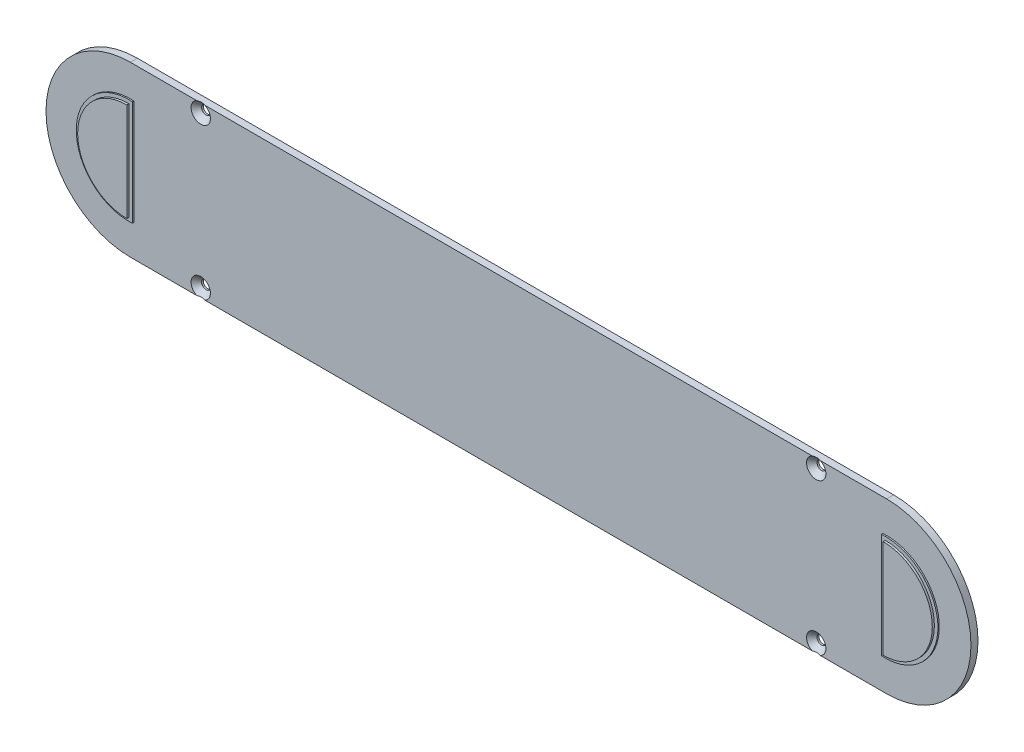
ISO-10303-21;
HEADER;
FILE_DESCRIPTION(('STEP AP214'),'2;1');
FILE_NAME('part.step','',(''),(''),'','','');
FILE_SCHEMA(('AUTOMOTIVE_DESIGN { 1 0 10303 214 1 1 1 1 }'));
ENDSEC;
DATA;
#1=APPLICATION_CONTEXT('core data for automotive mechanical design processes');
#2=APPLICATION_PROTOCOL_DEFINITION('international standard','automotive_design',2000,#1);
#3=PRODUCT_CONTEXT('',#1,'mechanical');
#4=PRODUCT('Part','Part','',(#3));
#5=PRODUCT_RELATED_PRODUCT_CATEGORY('part','',(#4));
#6=PRODUCT_DEFINITION_FORMATION('','',#4);
#7=PRODUCT_DEFINITION_CONTEXT('part definition',#1,'design');
#8=PRODUCT_DEFINITION('design','',#6,#7);
#9=PRODUCT_DEFINITION_SHAPE('','',#8);
#10=(LENGTH_UNIT() NAMED_UNIT(*) SI_UNIT(.MILLI.,.METRE.));
#11=(NAMED_UNIT(*) PLANE_ANGLE_UNIT() SI_UNIT($,.RADIAN.));
#12=(NAMED_UNIT(*) SI_UNIT($,.STERADIAN.) SOLID_ANGLE_UNIT());
#13=UNCERTAINTY_MEASURE_WITH_UNIT(LENGTH_MEASURE(1.E-05),#10,'distance_accuracy_value','');
#14=(GEOMETRIC_REPRESENTATION_CONTEXT(3) GLOBAL_UNCERTAINTY_ASSIGNED_CONTEXT((#13)) GLOBAL_UNIT_ASSIGNED_CONTEXT((#10,
#11,#12)) REPRESENTATION_CONTEXT('',''));
#15=CARTESIAN_POINT('',(0.,0.,0.));
#16=DIRECTION('',(0.,0.,1.));
#17=DIRECTION('',(1.,0.,0.));
#18=AXIS2_PLACEMENT_3D('',#15,#16,#17);
#19=CARTESIAN_POINT('',(-107.5,0.,2.));
#20=DIRECTION('',(0.,0.,1.));
#21=DIRECTION('',(1.,0.,0.));
#22=AXIS2_PLACEMENT_3D('',#19,#20,#21);
#23=PLANE('',#22);
#24=DIRECTION('',(0.,1.,0.));
#25=VECTOR('',#24,1.);
#26=CARTESIAN_POINT('',(-106.5,-14.9666295470958,2.));
#27=LINE('',#26,#25);
#28=CARTESIAN_POINT('',(-106.5,-14.9666295470958,2.));
#29=VERTEX_POINT('',#28);
#30=CARTESIAN_POINT('',(-106.5,14.9666295470958,2.));
#31=VERTEX_POINT('',#30);
#32=EDGE_CURVE('E177',#29,#31,#27,.T.);
#33=ORIENTED_EDGE('',*,*,#32,.F.);
#34=CARTESIAN_POINT('',(-107.5,0.,2.));
#35=DIRECTION('',(0.,0.,1.));
#36=DIRECTION('',(1.,0.,0.));
#37=AXIS2_PLACEMENT_3D('',#34,#35,#36);
#38=CIRCLE('',#37,15.);
#39=EDGE_CURVE('E172',#31,#29,#38,.T.);
#40=ORIENTED_EDGE('',*,*,#39,.F.);
#41=EDGE_LOOP('',(#33,#40));
#42=FACE_BOUND('',#41,.T.);
#43=DIRECTION('',(-1.,0.,0.));
#44=VECTOR('',#43,1.);
#45=CARTESIAN_POINT('',(107.5,24.,2.));
#46=LINE('',#45,#44);
#47=CARTESIAN_POINT('',(107.5,24.,2.));
#48=VERTEX_POINT('',#47);
#49=CARTESIAN_POINT('',(88.6456439237392,24.,2.));
#50=VERTEX_POINT('',#49);
#51=EDGE_CURVE('E226',#48,#50,#46,.T.);
#52=ORIENTED_EDGE('',*,*,#51,.T.);
#53=CARTESIAN_POINT('',(87.5,21.5,2.));
#54=DIRECTION('',(0.,0.,1.));
#55=DIRECTION('',(1.,0.,0.));
#56=AXIS2_PLACEMENT_3D('',#53,#54,#55);
#57=CIRCLE('',#56,2.75000000000006);
#58=CARTESIAN_POINT('',(86.3543560762609,24.,2.));
#59=VERTEX_POINT('',#58);
#60=EDGE_CURVE('E271',#50,#59,#57,.F.);
#61=ORIENTED_EDGE('',*,*,#60,.T.);
#62=CARTESIAN_POINT('',(-86.3543560762609,24.,2.));
#63=VERTEX_POINT('',#62);
#64=EDGE_CURVE('E249',#59,#63,#46,.T.);
#65=ORIENTED_EDGE('',*,*,#64,.T.);
#66=CARTESIAN_POINT('',(-87.5,21.5,2.));
#67=DIRECTION('',(0.,0.,1.));
#68=DIRECTION('',(1.,0.,0.));
#69=AXIS2_PLACEMENT_3D('',#66,#67,#68);
#70=CIRCLE('',#69,2.75000000000006);
#71=CARTESIAN_POINT('',(-88.645643923739,24.,2.));
#72=VERTEX_POINT('',#71);
#73=EDGE_CURVE('E262',#63,#72,#70,.F.);
#74=ORIENTED_EDGE('',*,*,#73,.T.);
#75=CARTESIAN_POINT('',(-107.5,24.,2.));
#76=VERTEX_POINT('',#75);
#77=EDGE_CURVE('E246',#72,#76,#46,.T.);
#78=ORIENTED_EDGE('',*,*,#77,.T.);
#79=CARTESIAN_POINT('',(-107.5,0.,2.));
#80=DIRECTION('',(0.,0.,1.));
#81=DIRECTION('',(1.,0.,0.));
#82=AXIS2_PLACEMENT_3D('',#79,#80,#81);
#83=CIRCLE('',#82,24.);
#84=CARTESIAN_POINT('',(-107.5,-24.,2.));
#85=VERTEX_POINT('',#84);
#86=EDGE_CURVE('E221',#76,#85,#83,.T.);
#87=ORIENTED_EDGE('',*,*,#86,.T.);
#88=DIRECTION('',(1.,0.,0.));
#89=VECTOR('',#88,1.);
#90=CARTESIAN_POINT('',(-107.5,-24.,2.));
#91=LINE('',#90,#89);
#92=CARTESIAN_POINT('',(-88.6456439237392,-24.,2.));
#93=VERTEX_POINT('',#92);
#94=EDGE_CURVE('E239',#85,#93,#91,.T.);
#95=ORIENTED_EDGE('',*,*,#94,.T.);
#96=CARTESIAN_POINT('',(-87.5,-21.5,2.));
#97=DIRECTION('',(0.,0.,1.));
#98=DIRECTION('',(1.,0.,0.));
#99=AXIS2_PLACEMENT_3D('',#96,#97,#98);
#100=CIRCLE('',#99,2.75000000000009);
#101=CARTESIAN_POINT('',(-86.3543560762608,-24.,2.));
#102=VERTEX_POINT('',#101);
#103=EDGE_CURVE('E265',#93,#102,#100,.F.);
#104=ORIENTED_EDGE('',*,*,#103,.T.);
#105=CARTESIAN_POINT('',(86.3543560762609,-24.,2.));
#106=VERTEX_POINT('',#105);
#107=EDGE_CURVE('E243',#102,#106,#91,.T.);
#108=ORIENTED_EDGE('',*,*,#107,.T.);
#109=CARTESIAN_POINT('',(87.5,-21.5,2.));
#110=DIRECTION('',(0.,0.,1.));
#111=DIRECTION('',(1.,0.,0.));
#112=AXIS2_PLACEMENT_3D('',#109,#110,#111);
#113=CIRCLE('',#112,2.75000000000006);
#114=CARTESIAN_POINT('',(88.6456439237391,-24.,2.));
#115=VERTEX_POINT('',#114);
#116=EDGE_CURVE('E268',#106,#115,#113,.F.);
#117=ORIENTED_EDGE('',*,*,#116,.T.);
#118=CARTESIAN_POINT('',(107.5,-24.,2.));
#119=VERTEX_POINT('',#118);
#120=EDGE_CURVE('E238',#115,#119,#91,.T.);
#121=ORIENTED_EDGE('',*,*,#120,.T.);
#122=CARTESIAN_POINT('',(107.5,0.,2.));
#123=DIRECTION('',(0.,0.,1.));
#124=DIRECTION('',(1.,0.,0.));
#125=AXIS2_PLACEMENT_3D('',#122,#123,#124);
#126=CIRCLE('',#125,24.);
#127=EDGE_CURVE('E242',#119,#48,#126,.T.);
#128=ORIENTED_EDGE('',*,*,#127,.T.);
#129=EDGE_LOOP('',(#52,#61,#65,#74,#78,#87,#95,#104,#108,#117,#121,#128));
#130=FACE_BOUND('',#129,.T.);
#131=DIRECTION('',(0.,-1.,0.));
#132=VECTOR('',#131,1.);
#133=CARTESIAN_POINT('',(106.5,14.9666295470958,2.));
#134=LINE('',#133,#132);
#135=CARTESIAN_POINT('',(106.5,14.9666295470958,2.));
#136=VERTEX_POINT('',#135);
#137=CARTESIAN_POINT('',(106.5,-14.9666295470958,2.));
#138=VERTEX_POINT('',#137);
#139=EDGE_CURVE('E159',#136,#138,#134,.T.);
#140=ORIENTED_EDGE('',*,*,#139,.F.);
#141=CARTESIAN_POINT('',(107.5,0.,2.));
#142=DIRECTION('',(0.,0.,1.));
#143=DIRECTION('',(1.,0.,0.));
#144=AXIS2_PLACEMENT_3D('',#141,#142,#143);
#145=CIRCLE('',#144,15.);
#146=EDGE_CURVE('E49',#138,#136,#145,.T.);
#147=ORIENTED_EDGE('',*,*,#146,.F.);
#148=EDGE_LOOP('',(#140,#147));
#149=FACE_BOUND('',#148,.T.);
#150=ADVANCED_FACE('F33',(#42,#130,#149),#23,.T.);
#151=CARTESIAN_POINT('',(-107.5,0.,0.));
#152=DIRECTION('',(0.,0.,1.));
#153=DIRECTION('',(1.,0.,0.));
#154=AXIS2_PLACEMENT_3D('',#151,#152,#153);
#155=CYLINDRICAL_SURFACE('',#154,24.);
#156=ORIENTED_EDGE('',*,*,#86,.F.);
#157=DIRECTION('',(0.,0.,1.));
#158=VECTOR('',#157,1.);
#159=CARTESIAN_POINT('',(-107.5,24.,0.));
#160=LINE('',#159,#158);
#161=CARTESIAN_POINT('',(-107.5,24.,0.));
#162=VERTEX_POINT('',#161);
#163=EDGE_CURVE('E250',#162,#76,#160,.T.);
#164=ORIENTED_EDGE('',*,*,#163,.F.);
#165=CARTESIAN_POINT('',(-107.5,0.,0.));
#166=DIRECTION('',(0.,0.,1.));
#167=DIRECTION('',(1.,0.,0.));
#168=AXIS2_PLACEMENT_3D('',#165,#166,#167);
#169=CIRCLE('',#168,24.);
#170=CARTESIAN_POINT('',(-107.5,-24.,0.));
#171=VERTEX_POINT('',#170);
#172=EDGE_CURVE('E222',#162,#171,#169,.T.);
#173=ORIENTED_EDGE('',*,*,#172,.T.);
#174=DIRECTION('',(0.,0.,1.));
#175=VECTOR('',#174,1.);
#176=CARTESIAN_POINT('',(-107.5,-24.,0.));
#177=LINE('',#176,#175);
#178=EDGE_CURVE('E235',#171,#85,#177,.T.);
#179=ORIENTED_EDGE('',*,*,#178,.T.);
#180=EDGE_LOOP('',(#156,#164,#173,#179));
#181=FACE_BOUND('',#180,.T.);
#182=ADVANCED_FACE('F292',(#181),#155,.T.);
#183=CARTESIAN_POINT('',(107.5,24.,0.));
#184=DIRECTION('',(0.,1.,0.));
#185=DIRECTION('',(-1.,0.,0.));
#186=AXIS2_PLACEMENT_3D('',#183,#184,#185);
#187=PLANE('',#186);
#188=ORIENTED_EDGE('',*,*,#64,.F.);
#189=CARTESIAN_POINT('',(86.3543560762609,24.,2.));
#190=CARTESIAN_POINT('',(86.4387621160316,24.,1.96483137179476));
#191=CARTESIAN_POINT('',(86.5244094806144,24.,1.93236499251594));
#192=CARTESIAN_POINT('',(86.6982325447831,24.,1.874140577509));
#193=CARTESIAN_POINT('',(86.7864152410339,24.,1.84840358705028));
#194=CARTESIAN_POINT('',(86.9639497535042,24.,1.80538984076342));
#195=CARTESIAN_POINT('',(87.053281443329,24.,1.78803209866768));
#196=CARTESIAN_POINT('',(87.2331686113206,24.,1.76262661852657));
#197=CARTESIAN_POINT('',(87.3237223485654,24.,1.75456681300498));
#198=CARTESIAN_POINT('',(87.5005204880953,24.,1.74851915694905));
#199=CARTESIAN_POINT('',(87.5867478937963,24.,1.75003627910019));
#200=CARTESIAN_POINT('',(87.7586271303844,24.,1.76187791632524));
#201=CARTESIAN_POINT('',(87.844278657842,24.,1.77220675592079));
#202=CARTESIAN_POINT('',(88.014124519429,24.,1.80094374692522));
#203=CARTESIAN_POINT('',(88.0983198273198,24.,1.81934626380263));
#204=CARTESIAN_POINT('',(88.2648670163354,24.,1.8631510460709));
#205=CARTESIAN_POINT('',(88.347218478945,24.,1.88855488354805));
#206=CARTESIAN_POINT('',(88.4651758301111,24.,1.92962366336638));
#207=CARTESIAN_POINT('',(88.5016106615225,24.,1.9429728799022));
#208=CARTESIAN_POINT('',(88.5739783555768,24.,1.97071992207543));
#209=CARTESIAN_POINT('',(88.609912218487,24.,1.98511513572856));
#210=CARTESIAN_POINT('',(88.6456439237392,24.,1.99999999999999));
#211=B_SPLINE_CURVE_WITH_KNOTS('',3,(#189,#190,#191,#192,#193,#194,#195,#196,#197,#198,#199,
#200,#201,#202,#203,#204,#205,#206,#207,#208,#209,#210),.UNSPECIFIED.,.F.,.F.,(4,2,2,2,2,2,2,2,
2,2,4),(0.,0.274432880279953,0.549714016171042,0.822278439854727,1.09448871202289,
1.35274793675298,1.61113398017939,1.86933998493428,2.12760401492842,2.24400093290923,
2.36011657062673),.UNSPECIFIED.);
#212=EDGE_CURVE('E280',#59,#50,#211,.T.);
#213=ORIENTED_EDGE('',*,*,#212,.T.);
#214=ORIENTED_EDGE('',*,*,#51,.F.);
#215=DIRECTION('',(0.,0.,1.));
#216=VECTOR('',#215,1.);
#217=CARTESIAN_POINT('',(107.5,24.,0.));
#218=LINE('',#217,#216);
#219=CARTESIAN_POINT('',(107.5,24.,0.));
#220=VERTEX_POINT('',#219);
#221=EDGE_CURVE('E254',#220,#48,#218,.T.);
#222=ORIENTED_EDGE('',*,*,#221,.F.);
#223=DIRECTION('',(-1.,0.,0.));
#224=VECTOR('',#223,1.);
#225=CARTESIAN_POINT('',(107.5,24.,0.));
#226=LINE('',#225,#224);
#227=EDGE_CURVE('E232',#220,#162,#226,.T.);
#228=ORIENTED_EDGE('',*,*,#227,.T.);
#229=ORIENTED_EDGE('',*,*,#163,.T.);
#230=ORIENTED_EDGE('',*,*,#77,.F.);
#231=CARTESIAN_POINT('',(-88.6456439237391,24.,2.));
#232=CARTESIAN_POINT('',(-88.5612378839683,24.,1.96483137179476));
#233=CARTESIAN_POINT('',(-88.4755905193855,24.,1.93236499251594));
#234=CARTESIAN_POINT('',(-88.3017674552168,24.,1.87414057750901));
#235=CARTESIAN_POINT('',(-88.213584758966,24.,1.84840358705029));
#236=CARTESIAN_POINT('',(-88.0360502464957,24.,1.80538984076344));
#237=CARTESIAN_POINT('',(-87.9467185566709,24.,1.7880320986677));
#238=CARTESIAN_POINT('',(-87.7668313886794,24.,1.7626266185266));
#239=CARTESIAN_POINT('',(-87.6762776514345,24.,1.75456681300501));
#240=CARTESIAN_POINT('',(-87.4994795119046,24.,1.74851915694908));
#241=CARTESIAN_POINT('',(-87.4132521062036,24.,1.75003627910023));
#242=CARTESIAN_POINT('',(-87.2413728696156,24.,1.76187791632527));
#243=CARTESIAN_POINT('',(-87.1557213421579,24.,1.77220675592082));
#244=CARTESIAN_POINT('',(-86.9858754805709,24.,1.80094374692525));
#245=CARTESIAN_POINT('',(-86.9016801726802,24.,1.81934626380266));
#246=CARTESIAN_POINT('',(-86.7351329836646,24.,1.86315104607094));
#247=CARTESIAN_POINT('',(-86.652781521055,24.,1.88855488354809));
#248=CARTESIAN_POINT('',(-86.5348241698889,24.,1.92962366336641));
#249=CARTESIAN_POINT('',(-86.4983893384775,24.,1.94297287990223));
#250=CARTESIAN_POINT('',(-86.4260216444232,24.,1.97071992207544));
#251=CARTESIAN_POINT('',(-86.3900877815131,24.,1.98511513572856));
#252=CARTESIAN_POINT('',(-86.3543560762609,24.,1.99999999999999));
#253=B_SPLINE_CURVE_WITH_KNOTS('',3,(#231,#232,#233,#234,#235,#236,#237,#238,#239,#240,#241,
#242,#243,#244,#245,#246,#247,#248,#249,#250,#251,#252),.UNSPECIFIED.,.F.,.F.,(4,2,2,2,2,2,2,2,
2,2,4),(0.,0.274432880279952,0.549714016171024,0.822278439854694,1.09448871202286,
1.35274793675293,1.61113398017934,1.86933998493424,2.12760401492837,2.24400093290913,
2.36011657062658),.UNSPECIFIED.);
#254=EDGE_CURVE('E274',#72,#63,#253,.T.);
#255=ORIENTED_EDGE('',*,*,#254,.T.);
#256=EDGE_LOOP('',(#188,#213,#214,#222,#228,#229,#230,#255));
#257=FACE_BOUND('',#256,.T.);
#258=ADVANCED_FACE('F286',(#257),#187,.T.);
#259=CARTESIAN_POINT('',(107.5,0.,0.));
#260=DIRECTION('',(0.,0.,1.));
#261=DIRECTION('',(1.,0.,0.));
#262=AXIS2_PLACEMENT_3D('',#259,#260,#261);
#263=CYLINDRICAL_SURFACE('',#262,24.);
#264=ORIENTED_EDGE('',*,*,#127,.F.);
#265=DIRECTION('',(0.,0.,1.));
#266=VECTOR('',#265,1.);
#267=CARTESIAN_POINT('',(107.5,-24.,0.));
#268=LINE('',#267,#266);
#269=CARTESIAN_POINT('',(107.5,-24.,0.));
#270=VERTEX_POINT('',#269);
#271=EDGE_CURVE('E256',#270,#119,#268,.T.);
#272=ORIENTED_EDGE('',*,*,#271,.F.);
#273=CARTESIAN_POINT('',(107.5,0.,0.));
#274=DIRECTION('',(0.,0.,1.));
#275=DIRECTION('',(1.,0.,0.));
#276=AXIS2_PLACEMENT_3D('',#273,#274,#275);
#277=CIRCLE('',#276,24.);
#278=EDGE_CURVE('E229',#270,#220,#277,.T.);
#279=ORIENTED_EDGE('',*,*,#278,.T.);
#280=ORIENTED_EDGE('',*,*,#221,.T.);
#281=EDGE_LOOP('',(#264,#272,#279,#280));
#282=FACE_BOUND('',#281,.T.);
#283=ADVANCED_FACE('F291',(#282),#263,.T.);
#284=CARTESIAN_POINT('',(-107.5,-24.,0.));
#285=DIRECTION('',(0.,-1.,0.));
#286=DIRECTION('',(1.,0.,0.));
#287=AXIS2_PLACEMENT_3D('',#284,#285,#286);
#288=PLANE('',#287);
#289=ORIENTED_EDGE('',*,*,#120,.F.);
#290=CARTESIAN_POINT('',(88.6456439237391,-24.,2.));
#291=CARTESIAN_POINT('',(88.5612378839684,-24.,1.96483137179477));
#292=CARTESIAN_POINT('',(88.4755905193856,-24.,1.93236499251594));
#293=CARTESIAN_POINT('',(88.3017674552169,-24.,1.87414057750901));
#294=CARTESIAN_POINT('',(88.2135847589661,-24.,1.84840358705029));
#295=CARTESIAN_POINT('',(88.0360502464958,-24.,1.80538984076343));
#296=CARTESIAN_POINT('',(87.946718556671,-24.,1.78803209866769));
#297=CARTESIAN_POINT('',(87.7668313886794,-24.,1.76262661852659));
#298=CARTESIAN_POINT('',(87.6762776514346,-24.,1.754566813005));
#299=CARTESIAN_POINT('',(87.4994795119047,-24.,1.74851915694907));
#300=CARTESIAN_POINT('',(87.4132521062037,-24.,1.75003627910021));
#301=CARTESIAN_POINT('',(87.2413728696156,-24.,1.76187791632526));
#302=CARTESIAN_POINT('',(87.1557213421579,-24.,1.77220675592081));
#303=CARTESIAN_POINT('',(86.985875480571,-24.,1.80094374692524));
#304=CARTESIAN_POINT('',(86.9016801726802,-24.,1.81934626380265));
#305=CARTESIAN_POINT('',(86.7351329836646,-24.,1.86315104607093));
#306=CARTESIAN_POINT('',(86.652781521055,-24.,1.88855488354808));
#307=CARTESIAN_POINT('',(86.5348241698889,-24.,1.9296236633664));
#308=CARTESIAN_POINT('',(86.4983893384775,-24.,1.94297287990222));
#309=CARTESIAN_POINT('',(86.4260216444232,-24.,1.97071992207544));
#310=CARTESIAN_POINT('',(86.3900877815131,-24.,1.98511513572856));
#311=CARTESIAN_POINT('',(86.3543560762609,-24.,1.99999999999999));
#312=B_SPLINE_CURVE_WITH_KNOTS('',3,(#290,#291,#292,#293,#294,#295,#296,#297,#298,#299,#300,
#301,#302,#303,#304,#305,#306,#307,#308,#309,#310,#311),.UNSPECIFIED.,.F.,.F.,(4,2,2,2,2,2,2,2,
2,2,4),(0.,0.274432880279952,0.549714016171025,0.822278439854709,1.09448871202286,
1.35274793675296,1.61113398017937,1.86933998493427,2.1276040149284,2.24400093290917,
2.36011657062664),.UNSPECIFIED.);
#313=EDGE_CURVE('E312',#115,#106,#312,.T.);
#314=ORIENTED_EDGE('',*,*,#313,.T.);
#315=ORIENTED_EDGE('',*,*,#107,.F.);
#316=CARTESIAN_POINT('',(-86.3543560762608,-24.,2.));
#317=CARTESIAN_POINT('',(-86.4387621160315,-24.,1.96483137179476));
#318=CARTESIAN_POINT('',(-86.5244094806143,-24.,1.93236499251593));
#319=CARTESIAN_POINT('',(-86.698232544783,-24.,1.87414057750898));
#320=CARTESIAN_POINT('',(-86.7864152410338,-24.,1.84840358705026));
#321=CARTESIAN_POINT('',(-86.9639497535042,-24.,1.8053898407634));
#322=CARTESIAN_POINT('',(-87.0532814433289,-24.,1.78803209866765));
#323=CARTESIAN_POINT('',(-87.2331686113205,-24.,1.76262661852654));
#324=CARTESIAN_POINT('',(-87.3237223485654,-24.,1.75456681300495));
#325=CARTESIAN_POINT('',(-87.5005204880953,-24.,1.74851915694901));
#326=CARTESIAN_POINT('',(-87.5867478937963,-24.,1.75003627910015));
#327=CARTESIAN_POINT('',(-87.7586271303843,-24.,1.76187791632519));
#328=CARTESIAN_POINT('',(-87.844278657842,-24.,1.77220675592074));
#329=CARTESIAN_POINT('',(-88.014124519429,-24.,1.80094374692518));
#330=CARTESIAN_POINT('',(-88.0983198273197,-24.,1.81934626380258));
#331=CARTESIAN_POINT('',(-88.2648670163353,-24.,1.86315104607086));
#332=CARTESIAN_POINT('',(-88.347218478945,-24.,1.88855488354801));
#333=CARTESIAN_POINT('',(-88.4651758301111,-24.,1.92962366336634));
#334=CARTESIAN_POINT('',(-88.5016106615225,-24.,1.94297287990217));
#335=CARTESIAN_POINT('',(-88.5739783555768,-24.,1.97071992207541));
#336=CARTESIAN_POINT('',(-88.609912218487,-24.,1.98511513572854));
#337=CARTESIAN_POINT('',(-88.6456439237392,-24.,1.99999999999999));
#338=B_SPLINE_CURVE_WITH_KNOTS('',3,(#316,#317,#318,#319,#320,#321,#322,#323,#324,#325,#326,
#327,#328,#329,#330,#331,#332,#333,#334,#335,#336,#337),.UNSPECIFIED.,.F.,.F.,(4,2,2,2,2,2,2,2,
2,2,4),(0.,0.274432880279971,0.549714016171062,0.822278439854762,1.09448871202294,
1.35274793675304,1.61113398017945,1.86933998493435,2.12760401492849,2.24400093290934,
2.36011657062691),.UNSPECIFIED.);
#339=EDGE_CURVE('E307',#102,#93,#338,.T.);
#340=ORIENTED_EDGE('',*,*,#339,.T.);
#341=ORIENTED_EDGE('',*,*,#94,.F.);
#342=ORIENTED_EDGE('',*,*,#178,.F.);
#343=DIRECTION('',(1.,0.,0.));
#344=VECTOR('',#343,1.);
#345=CARTESIAN_POINT('',(-107.5,-24.,0.));
#346=LINE('',#345,#344);
#347=EDGE_CURVE('E225',#171,#270,#346,.T.);
#348=ORIENTED_EDGE('',*,*,#347,.T.);
#349=ORIENTED_EDGE('',*,*,#271,.T.);
#350=EDGE_LOOP('',(#289,#314,#315,#340,#341,#342,#348,#349));
#351=FACE_BOUND('',#350,.T.);
#352=ADVANCED_FACE('F298',(#351),#288,.T.);
#353=CARTESIAN_POINT('',(-107.5,0.,0.));
#354=DIRECTION('',(0.,0.,1.));
#355=DIRECTION('',(1.,0.,0.));
#356=AXIS2_PLACEMENT_3D('',#353,#354,#355);
#357=PLANE('',#356);
#358=CARTESIAN_POINT('',(87.5,-21.5,0.));
#359=DIRECTION('',(0.,0.,1.));
#360=DIRECTION('',(1.,0.,0.));
#361=AXIS2_PLACEMENT_3D('',#358,#359,#360);
#362=CIRCLE('',#361,1.25);
#363=CARTESIAN_POINT('',(88.75,-21.5,0.));
#364=VERTEX_POINT('',#363);
#365=EDGE_CURVE('E209',#364,#364,#362,.T.);
#366=ORIENTED_EDGE('',*,*,#365,.T.);
#367=EDGE_LOOP('',(#366));
#368=FACE_BOUND('',#367,.T.);
#369=CARTESIAN_POINT('',(87.5,21.5,0.));
#370=DIRECTION('',(0.,0.,1.));
#371=DIRECTION('',(1.,0.,0.));
#372=AXIS2_PLACEMENT_3D('',#369,#370,#371);
#373=CIRCLE('',#372,1.25);
#374=CARTESIAN_POINT('',(88.75,21.5,0.));
#375=VERTEX_POINT('',#374);
#376=EDGE_CURVE('E212',#375,#375,#373,.T.);
#377=ORIENTED_EDGE('',*,*,#376,.T.);
#378=EDGE_LOOP('',(#377));
#379=FACE_BOUND('',#378,.T.);
#380=CARTESIAN_POINT('',(-87.5,21.5,0.));
#381=DIRECTION('',(0.,0.,1.));
#382=DIRECTION('',(1.,0.,0.));
#383=AXIS2_PLACEMENT_3D('',#380,#381,#382);
#384=CIRCLE('',#383,1.25);
#385=CARTESIAN_POINT('',(-86.25,21.5,0.));
#386=VERTEX_POINT('',#385);
#387=EDGE_CURVE('E215',#386,#386,#384,.T.);
#388=ORIENTED_EDGE('',*,*,#387,.T.);
#389=EDGE_LOOP('',(#388));
#390=FACE_BOUND('',#389,.T.);
#391=CARTESIAN_POINT('',(-87.5,-21.5,0.));
#392=DIRECTION('',(0.,0.,1.));
#393=DIRECTION('',(1.,0.,0.));
#394=AXIS2_PLACEMENT_3D('',#391,#392,#393);
#395=CIRCLE('',#394,1.24999999999998);
#396=CARTESIAN_POINT('',(-86.25,-21.5,0.));
#397=VERTEX_POINT('',#396);
#398=EDGE_CURVE('E218',#397,#397,#395,.T.);
#399=ORIENTED_EDGE('',*,*,#398,.T.);
#400=EDGE_LOOP('',(#399));
#401=FACE_BOUND('',#400,.T.);
#402=ORIENTED_EDGE('',*,*,#172,.F.);
#403=ORIENTED_EDGE('',*,*,#227,.F.);
#404=ORIENTED_EDGE('',*,*,#278,.F.);
#405=ORIENTED_EDGE('',*,*,#347,.F.);
#406=EDGE_LOOP('',(#402,#403,#404,#405));
#407=FACE_BOUND('',#406,.T.);
#408=ADVANCED_FACE('F303',(#368,#379,#390,#401,#407),#357,.F.);
#409=CARTESIAN_POINT('',(-87.5,-21.5,0.));
#410=DIRECTION('',(0.,0.,1.));
#411=DIRECTION('',(1.,0.,0.));
#412=AXIS2_PLACEMENT_3D('',#409,#410,#411);
#413=CYLINDRICAL_SURFACE('',#412,1.24999999999998);
#414=CARTESIAN_POINT('',(-87.5,-21.5,0.499999999999894));
#415=DIRECTION('',(0.,0.,1.));
#416=DIRECTION('',(1.,0.,0.));
#417=AXIS2_PLACEMENT_3D('',#414,#415,#416);
#418=CIRCLE('',#417,1.24999999999998);
#419=CARTESIAN_POINT('',(-86.25,-21.5,0.499999999999894));
#420=VERTEX_POINT('',#419);
#421=EDGE_CURVE('E42',#420,#420,#418,.T.);
#422=ORIENTED_EDGE('',*,*,#421,.T.);
#423=EDGE_LOOP('',(#422));
#424=FACE_BOUND('',#423,.T.);
#425=ORIENTED_EDGE('',*,*,#398,.F.);
#426=EDGE_LOOP('',(#425));
#427=FACE_BOUND('',#426,.T.);
#428=ADVANCED_FACE('F396',(#424,#427),#413,.F.);
#429=CARTESIAN_POINT('',(-87.5,21.5,0.));
#430=DIRECTION('',(0.,0.,1.));
#431=DIRECTION('',(1.,0.,0.));
#432=AXIS2_PLACEMENT_3D('',#429,#430,#431);
#433=CYLINDRICAL_SURFACE('',#432,1.25);
#434=CARTESIAN_POINT('',(-87.5,21.5,0.499999999999936));
#435=DIRECTION('',(0.,0.,1.));
#436=DIRECTION('',(1.,0.,0.));
#437=AXIS2_PLACEMENT_3D('',#434,#435,#436);
#438=CIRCLE('',#437,1.25);
#439=CARTESIAN_POINT('',(-86.25,21.5,0.499999999999936));
#440=VERTEX_POINT('',#439);
#441=EDGE_CURVE('E11',#440,#440,#438,.T.);
#442=ORIENTED_EDGE('',*,*,#441,.T.);
#443=EDGE_LOOP('',(#442));
#444=FACE_BOUND('',#443,.T.);
#445=ORIENTED_EDGE('',*,*,#387,.F.);
#446=EDGE_LOOP('',(#445));
#447=FACE_BOUND('',#446,.T.);
#448=ADVANCED_FACE('F392',(#444,#447),#433,.F.);
#449=CARTESIAN_POINT('',(87.5,21.5,0.));
#450=DIRECTION('',(0.,0.,1.));
#451=DIRECTION('',(1.,0.,0.));
#452=AXIS2_PLACEMENT_3D('',#449,#450,#451);
#453=CYLINDRICAL_SURFACE('',#452,1.25);
#454=CARTESIAN_POINT('',(87.5,21.5,0.499999999999936));
#455=DIRECTION('',(0.,0.,1.));
#456=DIRECTION('',(1.,0.,0.));
#457=AXIS2_PLACEMENT_3D('',#454,#455,#456);
#458=CIRCLE('',#457,1.25);
#459=CARTESIAN_POINT('',(88.75,21.5,0.499999999999936));
#460=VERTEX_POINT('',#459);
#461=EDGE_CURVE('E253',#460,#460,#458,.T.);
#462=ORIENTED_EDGE('',*,*,#461,.T.);
#463=EDGE_LOOP('',(#462));
#464=FACE_BOUND('',#463,.T.);
#465=ORIENTED_EDGE('',*,*,#376,.F.);
#466=EDGE_LOOP('',(#465));
#467=FACE_BOUND('',#466,.T.);
#468=ADVANCED_FACE('F388',(#464,#467),#453,.F.);
#469=CARTESIAN_POINT('',(87.5,-21.5,0.));
#470=DIRECTION('',(0.,0.,1.));
#471=DIRECTION('',(1.,0.,0.));
#472=AXIS2_PLACEMENT_3D('',#469,#470,#471);
#473=CYLINDRICAL_SURFACE('',#472,1.25);
#474=CARTESIAN_POINT('',(87.5,-21.5,0.499999999999936));
#475=DIRECTION('',(0.,0.,1.));
#476=DIRECTION('',(1.,0.,0.));
#477=AXIS2_PLACEMENT_3D('',#474,#475,#476);
#478=CIRCLE('',#477,1.25);
#479=CARTESIAN_POINT('',(88.75,-21.5,0.499999999999936));
#480=VERTEX_POINT('',#479);
#481=EDGE_CURVE('E429',#480,#480,#478,.T.);
#482=ORIENTED_EDGE('',*,*,#481,.T.);
#483=EDGE_LOOP('',(#482));
#484=FACE_BOUND('',#483,.T.);
#485=ORIENTED_EDGE('',*,*,#365,.F.);
#486=EDGE_LOOP('',(#485));
#487=FACE_BOUND('',#486,.T.);
#488=ADVANCED_FACE('F385',(#484,#487),#473,.F.);
#489=CARTESIAN_POINT('',(87.5,21.5,0.499999999999936));
#490=DIRECTION('',(0.,0.,1.));
#491=DIRECTION('',(1.,0.,0.));
#492=AXIS2_PLACEMENT_3D('',#489,#490,#491);
#493=CONICAL_SURFACE('',#492,1.25,0.785398163397447);
#494=ORIENTED_EDGE('',*,*,#212,.F.);
#495=ORIENTED_EDGE('',*,*,#60,.F.);
#496=EDGE_LOOP('',(#494,#495));
#497=FACE_BOUND('',#496,.T.);
#498=ORIENTED_EDGE('',*,*,#461,.F.);
#499=EDGE_LOOP('',(#498));
#500=FACE_BOUND('',#499,.T.);
#501=ADVANCED_FACE('F321',(#497,#500),#493,.F.);
#502=CARTESIAN_POINT('',(87.5,-21.5,0.499999999999936));
#503=DIRECTION('',(0.,0.,1.));
#504=DIRECTION('',(1.,0.,0.));
#505=AXIS2_PLACEMENT_3D('',#502,#503,#504);
#506=CONICAL_SURFACE('',#505,1.25,0.785398163397447);
#507=ORIENTED_EDGE('',*,*,#313,.F.);
#508=ORIENTED_EDGE('',*,*,#116,.F.);
#509=EDGE_LOOP('',(#507,#508));
#510=FACE_BOUND('',#509,.T.);
#511=ORIENTED_EDGE('',*,*,#481,.F.);
#512=EDGE_LOOP('',(#511));
#513=FACE_BOUND('',#512,.T.);
#514=ADVANCED_FACE('F317',(#510,#513),#506,.F.);
#515=CARTESIAN_POINT('',(-87.5,-21.5,0.499999999999894));
#516=DIRECTION('',(0.,0.,1.));
#517=DIRECTION('',(1.,0.,0.));
#518=AXIS2_PLACEMENT_3D('',#515,#516,#517);
#519=CONICAL_SURFACE('',#518,1.24999999999998,0.785398163397447);
#520=ORIENTED_EDGE('',*,*,#339,.F.);
#521=ORIENTED_EDGE('',*,*,#103,.F.);
#522=EDGE_LOOP('',(#520,#521));
#523=FACE_BOUND('',#522,.T.);
#524=ORIENTED_EDGE('',*,*,#421,.F.);
#525=EDGE_LOOP('',(#524));
#526=FACE_BOUND('',#525,.T.);
#527=ADVANCED_FACE('F320',(#523,#526),#519,.F.);
#528=CARTESIAN_POINT('',(-87.5,21.5,0.499999999999936));
#529=DIRECTION('',(0.,0.,1.));
#530=DIRECTION('',(1.,0.,0.));
#531=AXIS2_PLACEMENT_3D('',#528,#529,#530);
#532=CONICAL_SURFACE('',#531,1.25,0.785398163397447);
#533=ORIENTED_EDGE('',*,*,#254,.F.);
#534=ORIENTED_EDGE('',*,*,#73,.F.);
#535=EDGE_LOOP('',(#533,#534));
#536=FACE_BOUND('',#535,.T.);
#537=ORIENTED_EDGE('',*,*,#441,.F.);
#538=EDGE_LOOP('',(#537));
#539=FACE_BOUND('',#538,.T.);
#540=ADVANCED_FACE('F35',(#536,#539),#532,.F.);
#541=CARTESIAN_POINT('',(-107.5,0.,2.4));
#542=DIRECTION('',(0.,0.,1.));
#543=DIRECTION('',(1.,0.,0.));
#544=AXIS2_PLACEMENT_3D('',#541,#542,#543);
#545=PLANE('',#544);
#546=CARTESIAN_POINT('',(-107.5,0.,2.4));
#547=DIRECTION('',(0.,0.,1.));
#548=DIRECTION('',(1.,0.,0.));
#549=AXIS2_PLACEMENT_3D('',#546,#547,#548);
#550=CIRCLE('',#549,15.);
#551=CARTESIAN_POINT('',(-106.5,14.9666295470958,2.4));
#552=VERTEX_POINT('',#551);
#553=CARTESIAN_POINT('',(-106.5,-14.9666295470958,2.4));
#554=VERTEX_POINT('',#553);
#555=EDGE_CURVE('E173',#552,#554,#550,.T.);
#556=ORIENTED_EDGE('',*,*,#555,.T.);
#557=DIRECTION('',(0.,1.,0.));
#558=VECTOR('',#557,1.);
#559=CARTESIAN_POINT('',(-106.5,-14.9666295470958,2.4));
#560=LINE('',#559,#558);
#561=EDGE_CURVE('E176',#554,#552,#560,.T.);
#562=ORIENTED_EDGE('',*,*,#561,.T.);
#563=EDGE_LOOP('',(#556,#562));
#564=FACE_BOUND('',#563,.T.);
#565=DIRECTION('',(0.,1.,0.));
#566=VECTOR('',#565,1.);
#567=CARTESIAN_POINT('',(-107.5,-14.,2.4));
#568=LINE('',#567,#566);
#569=CARTESIAN_POINT('',(-107.5,-14.,2.4));
#570=VERTEX_POINT('',#569);
#571=CARTESIAN_POINT('',(-107.5,14.,2.4));
#572=VERTEX_POINT('',#571);
#573=EDGE_CURVE('E165',#570,#572,#568,.T.);
#574=ORIENTED_EDGE('',*,*,#573,.F.);
#575=CARTESIAN_POINT('',(-107.5,0.,2.4));
#576=DIRECTION('',(0.,0.,1.));
#577=DIRECTION('',(1.,0.,0.));
#578=AXIS2_PLACEMENT_3D('',#575,#576,#577);
#579=CIRCLE('',#578,14.);
#580=EDGE_CURVE('E162',#572,#570,#579,.T.);
#581=ORIENTED_EDGE('',*,*,#580,.F.);
#582=EDGE_LOOP('',(#574,#581));
#583=FACE_BOUND('',#582,.T.);
#584=ADVANCED_FACE('F330',(#564,#583),#545,.T.);
#585=CARTESIAN_POINT('',(-107.5,0.,2.4));
#586=DIRECTION('',(0.,0.,-1.));
#587=DIRECTION('',(-1.,0.,0.));
#588=AXIS2_PLACEMENT_3D('',#585,#586,#587);
#589=CYLINDRICAL_SURFACE('',#588,15.);
#590=ORIENTED_EDGE('',*,*,#39,.T.);
#591=DIRECTION('',(0.,0.,-1.));
#592=VECTOR('',#591,1.);
#593=CARTESIAN_POINT('',(-106.5,-14.9666295470958,2.4));
#594=LINE('',#593,#592);
#595=EDGE_CURVE('E184',#554,#29,#594,.T.);
#596=ORIENTED_EDGE('',*,*,#595,.F.);
#597=ORIENTED_EDGE('',*,*,#555,.F.);
#598=DIRECTION('',(0.,0.,-1.));
#599=VECTOR('',#598,1.);
#600=CARTESIAN_POINT('',(-106.5,14.9666295470958,2.4));
#601=LINE('',#600,#599);
#602=EDGE_CURVE('E179',#552,#31,#601,.T.);
#603=ORIENTED_EDGE('',*,*,#602,.T.);
#604=EDGE_LOOP('',(#590,#596,#597,#603));
#605=FACE_BOUND('',#604,.T.);
#606=ADVANCED_FACE('F367',(#605),#589,.T.);
#607=CARTESIAN_POINT('',(-106.5,-14.9666295470958,2.4));
#608=DIRECTION('',(-1.,0.,0.));
#609=DIRECTION('',(0.,0.,1.));
#610=AXIS2_PLACEMENT_3D('',#607,#608,#609);
#611=PLANE('',#610);
#612=ORIENTED_EDGE('',*,*,#32,.T.);
#613=ORIENTED_EDGE('',*,*,#602,.F.);
#614=ORIENTED_EDGE('',*,*,#561,.F.);
#615=ORIENTED_EDGE('',*,*,#595,.T.);
#616=EDGE_LOOP('',(#612,#613,#614,#615));
#617=FACE_BOUND('',#616,.T.);
#618=ADVANCED_FACE('F376',(#617),#611,.F.);
#619=CARTESIAN_POINT('',(-107.5,0.,3.));
#620=DIRECTION('',(0.,0.,1.));
#621=DIRECTION('',(1.,0.,0.));
#622=AXIS2_PLACEMENT_3D('',#619,#620,#621);
#623=PLANE('',#622);
#624=CARTESIAN_POINT('',(-107.5,0.,3.));
#625=DIRECTION('',(0.,0.,1.));
#626=DIRECTION('',(1.,0.,0.));
#627=AXIS2_PLACEMENT_3D('',#624,#625,#626);
#628=CIRCLE('',#627,14.);
#629=CARTESIAN_POINT('',(-107.5,14.,3.));
#630=VERTEX_POINT('',#629);
#631=CARTESIAN_POINT('',(-107.5,-14.,3.));
#632=VERTEX_POINT('',#631);
#633=EDGE_CURVE('E198',#630,#632,#628,.T.);
#634=ORIENTED_EDGE('',*,*,#633,.T.);
#635=DIRECTION('',(0.,1.,0.));
#636=VECTOR('',#635,1.);
#637=CARTESIAN_POINT('',(-107.5,14.,3.));
#638=LINE('',#637,#636);
#639=EDGE_CURVE('E201',#632,#630,#638,.T.);
#640=ORIENTED_EDGE('',*,*,#639,.T.);
#641=EDGE_LOOP('',(#634,#640));
#642=FACE_BOUND('',#641,.T.);
#643=ADVANCED_FACE('F372',(#642),#623,.T.);
#644=CARTESIAN_POINT('',(-107.5,14.,3.));
#645=DIRECTION('',(-1.,0.,0.));
#646=DIRECTION('',(0.,-1.,0.));
#647=AXIS2_PLACEMENT_3D('',#644,#645,#646);
#648=PLANE('',#647);
#649=DIRECTION('',(0.,0.,-1.));
#650=VECTOR('',#649,1.);
#651=CARTESIAN_POINT('',(-107.5,-14.,3.));
#652=LINE('',#651,#650);
#653=EDGE_CURVE('E206',#632,#570,#652,.T.);
#654=ORIENTED_EDGE('',*,*,#653,.T.);
#655=ORIENTED_EDGE('',*,*,#573,.T.);
#656=DIRECTION('',(0.,0.,-1.));
#657=VECTOR('',#656,1.);
#658=CARTESIAN_POINT('',(-107.5,14.,3.));
#659=LINE('',#658,#657);
#660=EDGE_CURVE('E203',#630,#572,#659,.T.);
#661=ORIENTED_EDGE('',*,*,#660,.F.);
#662=ORIENTED_EDGE('',*,*,#639,.F.);
#663=EDGE_LOOP('',(#654,#655,#661,#662));
#664=FACE_BOUND('',#663,.T.);
#665=ADVANCED_FACE('F375',(#664),#648,.F.);
#666=CARTESIAN_POINT('',(-107.5,0.,3.));
#667=DIRECTION('',(0.,0.,-1.));
#668=DIRECTION('',(-1.,0.,0.));
#669=AXIS2_PLACEMENT_3D('',#666,#667,#668);
#670=CYLINDRICAL_SURFACE('',#669,14.);
#671=ORIENTED_EDGE('',*,*,#660,.T.);
#672=ORIENTED_EDGE('',*,*,#580,.T.);
#673=ORIENTED_EDGE('',*,*,#653,.F.);
#674=ORIENTED_EDGE('',*,*,#633,.F.);
#675=EDGE_LOOP('',(#671,#672,#673,#674));
#676=FACE_BOUND('',#675,.T.);
#677=ADVANCED_FACE('F380',(#676),#670,.T.);
#678=CARTESIAN_POINT('',(107.5,0.,2.4));
#679=DIRECTION('',(0.,0.,1.));
#680=DIRECTION('',(1.,0.,0.));
#681=AXIS2_PLACEMENT_3D('',#678,#679,#680);
#682=PLANE('',#681);
#683=CARTESIAN_POINT('',(107.5,0.,2.4));
#684=DIRECTION('',(0.,0.,1.));
#685=DIRECTION('',(1.,0.,0.));
#686=AXIS2_PLACEMENT_3D('',#683,#684,#685);
#687=CIRCLE('',#686,15.);
#688=CARTESIAN_POINT('',(106.5,-14.9666295470958,2.4));
#689=VERTEX_POINT('',#688);
#690=CARTESIAN_POINT('',(106.5,14.9666295470958,2.4));
#691=VERTEX_POINT('',#690);
#692=EDGE_CURVE('E156',#689,#691,#687,.T.);
#693=ORIENTED_EDGE('',*,*,#692,.T.);
#694=DIRECTION('',(0.,-1.,0.));
#695=VECTOR('',#694,1.);
#696=CARTESIAN_POINT('',(106.5,14.9666295470958,2.4));
#697=LINE('',#696,#695);
#698=EDGE_CURVE('E148',#691,#689,#697,.T.);
#699=ORIENTED_EDGE('',*,*,#698,.T.);
#700=EDGE_LOOP('',(#693,#699));
#701=FACE_BOUND('',#700,.T.);
#702=DIRECTION('',(0.,-1.,0.));
#703=VECTOR('',#702,1.);
#704=CARTESIAN_POINT('',(107.5,14.,2.4));
#705=LINE('',#704,#703);
#706=CARTESIAN_POINT('',(107.5,14.,2.4));
#707=VERTEX_POINT('',#706);
#708=CARTESIAN_POINT('',(107.5,-14.,2.4));
#709=VERTEX_POINT('',#708);
#710=EDGE_CURVE('E345',#707,#709,#705,.T.);
#711=ORIENTED_EDGE('',*,*,#710,.F.);
#712=CARTESIAN_POINT('',(107.5,0.,2.4));
#713=DIRECTION('',(0.,0.,1.));
#714=DIRECTION('',(1.,0.,0.));
#715=AXIS2_PLACEMENT_3D('',#712,#713,#714);
#716=CIRCLE('',#715,14.);
#717=EDGE_CURVE('E56',#709,#707,#716,.T.);
#718=ORIENTED_EDGE('',*,*,#717,.F.);
#719=EDGE_LOOP('',(#711,#718));
#720=FACE_BOUND('',#719,.T.);
#721=ADVANCED_FACE('F158',(#701,#720),#682,.T.);
#722=CARTESIAN_POINT('',(107.5,0.,2.4));
#723=DIRECTION('',(0.,0.,-1.));
#724=DIRECTION('',(-1.,0.,0.));
#725=AXIS2_PLACEMENT_3D('',#722,#723,#724);
#726=CYLINDRICAL_SURFACE('',#725,15.);
#727=ORIENTED_EDGE('',*,*,#146,.T.);
#728=DIRECTION('',(0.,0.,-1.));
#729=VECTOR('',#728,1.);
#730=CARTESIAN_POINT('',(106.5,14.9666295470958,2.4));
#731=LINE('',#730,#729);
#732=EDGE_CURVE('E151',#691,#136,#731,.T.);
#733=ORIENTED_EDGE('',*,*,#732,.F.);
#734=ORIENTED_EDGE('',*,*,#692,.F.);
#735=DIRECTION('',(0.,0.,-1.));
#736=VECTOR('',#735,1.);
#737=CARTESIAN_POINT('',(106.5,-14.9666295470958,2.4));
#738=LINE('',#737,#736);
#739=EDGE_CURVE('E153',#689,#138,#738,.T.);
#740=ORIENTED_EDGE('',*,*,#739,.T.);
#741=EDGE_LOOP('',(#727,#733,#734,#740));
#742=FACE_BOUND('',#741,.T.);
#743=ADVANCED_FACE('F161',(#742),#726,.T.);
#744=CARTESIAN_POINT('',(106.5,14.9666295470958,2.4));
#745=DIRECTION('',(1.,0.,0.));
#746=DIRECTION('',(0.,0.,-1.));
#747=AXIS2_PLACEMENT_3D('',#744,#745,#746);
#748=PLANE('',#747);
#749=ORIENTED_EDGE('',*,*,#139,.T.);
#750=ORIENTED_EDGE('',*,*,#739,.F.);
#751=ORIENTED_EDGE('',*,*,#698,.F.);
#752=ORIENTED_EDGE('',*,*,#732,.T.);
#753=EDGE_LOOP('',(#749,#750,#751,#752));
#754=FACE_BOUND('',#753,.T.);
#755=ADVANCED_FACE('F150',(#754),#748,.F.);
#756=CARTESIAN_POINT('',(107.5,0.,3.));
#757=DIRECTION('',(0.,0.,1.));
#758=DIRECTION('',(1.,0.,0.));
#759=AXIS2_PLACEMENT_3D('',#756,#757,#758);
#760=PLANE('',#759);
#761=CARTESIAN_POINT('',(107.5,0.,3.));
#762=DIRECTION('',(0.,0.,1.));
#763=DIRECTION('',(1.,0.,0.));
#764=AXIS2_PLACEMENT_3D('',#761,#762,#763);
#765=CIRCLE('',#764,14.);
#766=CARTESIAN_POINT('',(107.5,-14.,3.));
#767=VERTEX_POINT('',#766);
#768=CARTESIAN_POINT('',(107.5,14.,3.));
#769=VERTEX_POINT('',#768);
#770=EDGE_CURVE('E187',#767,#769,#765,.T.);
#771=ORIENTED_EDGE('',*,*,#770,.T.);
#772=DIRECTION('',(0.,-1.,0.));
#773=VECTOR('',#772,1.);
#774=CARTESIAN_POINT('',(107.5,14.,3.));
#775=LINE('',#774,#773);
#776=EDGE_CURVE('E190',#769,#767,#775,.T.);
#777=ORIENTED_EDGE('',*,*,#776,.T.);
#778=EDGE_LOOP('',(#771,#777));
#779=FACE_BOUND('',#778,.T.);
#780=ADVANCED_FACE('F357',(#779),#760,.T.);
#781=CARTESIAN_POINT('',(107.5,14.,3.));
#782=DIRECTION('',(1.,0.,0.));
#783=DIRECTION('',(0.,0.,-1.));
#784=AXIS2_PLACEMENT_3D('',#781,#782,#783);
#785=PLANE('',#784);
#786=DIRECTION('',(0.,0.,-1.));
#787=VECTOR('',#786,1.);
#788=CARTESIAN_POINT('',(107.5,14.,3.));
#789=LINE('',#788,#787);
#790=EDGE_CURVE('E195',#769,#707,#789,.T.);
#791=ORIENTED_EDGE('',*,*,#790,.T.);
#792=ORIENTED_EDGE('',*,*,#710,.T.);
#793=DIRECTION('',(0.,0.,-1.));
#794=VECTOR('',#793,1.);
#795=CARTESIAN_POINT('',(107.5,-14.,3.));
#796=LINE('',#795,#794);
#797=EDGE_CURVE('E192',#767,#709,#796,.T.);
#798=ORIENTED_EDGE('',*,*,#797,.F.);
#799=ORIENTED_EDGE('',*,*,#776,.F.);
#800=EDGE_LOOP('',(#791,#792,#798,#799));
#801=FACE_BOUND('',#800,.T.);
#802=ADVANCED_FACE('F355',(#801),#785,.F.);
#803=CARTESIAN_POINT('',(107.5,0.,3.));
#804=DIRECTION('',(0.,0.,-1.));
#805=DIRECTION('',(-1.,0.,0.));
#806=AXIS2_PLACEMENT_3D('',#803,#804,#805);
#807=CYLINDRICAL_SURFACE('',#806,14.);
#808=ORIENTED_EDGE('',*,*,#797,.T.);
#809=ORIENTED_EDGE('',*,*,#717,.T.);
#810=ORIENTED_EDGE('',*,*,#790,.F.);
#811=ORIENTED_EDGE('',*,*,#770,.F.);
#812=EDGE_LOOP('',(#808,#809,#810,#811));
#813=FACE_BOUND('',#812,.T.);
#814=ADVANCED_FACE('F351',(#813),#807,.T.);
#815=CLOSED_SHELL('',(#150,#182,#258,#283,#352,#408,#428,#448,#468,#488,#501,#514,#527,#540,
#584,#606,#618,#643,#665,#677,#721,#743,#755,#780,#802,#814));
#816=MANIFOLD_SOLID_BREP('B2',#815);
#817=ADVANCED_BREP_SHAPE_REPRESENTATION('',(#18,#816),#14);
#818=SHAPE_DEFINITION_REPRESENTATION(#9,#817);
ENDSEC;
END-ISO-10303-21;
